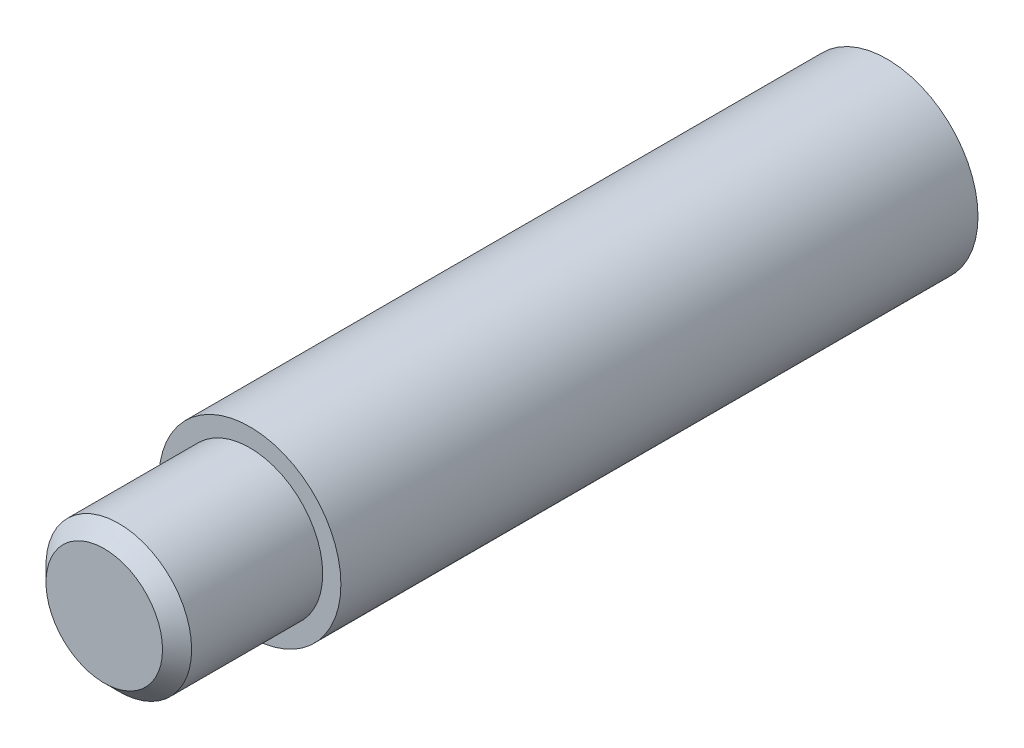
ISO-10303-21;
HEADER;
FILE_DESCRIPTION(('STEP AP214'),'2;1');
FILE_NAME('part.step','',(''),(''),'','','');
FILE_SCHEMA(('AUTOMOTIVE_DESIGN { 1 0 10303 214 1 1 1 1 }'));
ENDSEC;
DATA;
#1=APPLICATION_CONTEXT('core data for automotive mechanical design processes');
#2=APPLICATION_PROTOCOL_DEFINITION('international standard','automotive_design',2000,#1);
#3=PRODUCT_CONTEXT('',#1,'mechanical');
#4=PRODUCT('Part','Part','',(#3));
#5=PRODUCT_RELATED_PRODUCT_CATEGORY('part','',(#4));
#6=PRODUCT_DEFINITION_FORMATION('','',#4);
#7=PRODUCT_DEFINITION_CONTEXT('part definition',#1,'design');
#8=PRODUCT_DEFINITION('design','',#6,#7);
#9=PRODUCT_DEFINITION_SHAPE('','',#8);
#10=(LENGTH_UNIT() NAMED_UNIT(*) SI_UNIT(.MILLI.,.METRE.));
#11=(NAMED_UNIT(*) PLANE_ANGLE_UNIT() SI_UNIT($,.RADIAN.));
#12=(NAMED_UNIT(*) SI_UNIT($,.STERADIAN.) SOLID_ANGLE_UNIT());
#13=UNCERTAINTY_MEASURE_WITH_UNIT(LENGTH_MEASURE(1.E-05),#10,'distance_accuracy_value','');
#14=(GEOMETRIC_REPRESENTATION_CONTEXT(3) GLOBAL_UNCERTAINTY_ASSIGNED_CONTEXT((#13)) GLOBAL_UNIT_ASSIGNED_CONTEXT((#10,
#11,#12)) REPRESENTATION_CONTEXT('',''));
#15=CARTESIAN_POINT('',(0.,0.,0.));
#16=DIRECTION('',(0.,0.,1.));
#17=DIRECTION('',(1.,0.,0.));
#18=AXIS2_PLACEMENT_3D('',#15,#16,#17);
#19=CARTESIAN_POINT('',(0.,0.,35.));
#20=DIRECTION('',(0.,0.,1.));
#21=DIRECTION('',(1.,0.,0.));
#22=AXIS2_PLACEMENT_3D('',#19,#20,#21);
#23=PLANE('',#22);
#24=CARTESIAN_POINT('',(0.,0.,35.));
#25=DIRECTION('',(0.,0.,1.));
#26=DIRECTION('',(1.,0.,0.));
#27=AXIS2_PLACEMENT_3D('',#24,#25,#26);
#28=CIRCLE('',#27,5.);
#29=CARTESIAN_POINT('',(5.,0.,35.));
#30=VERTEX_POINT('',#29);
#31=EDGE_CURVE('E48',#30,#30,#28,.T.);
#32=ORIENTED_EDGE('',*,*,#31,.T.);
#33=EDGE_LOOP('',(#32));
#34=FACE_BOUND('',#33,.T.);
#35=CARTESIAN_POINT('',(0.,0.,35.));
#36=DIRECTION('',(0.,0.,1.));
#37=DIRECTION('',(1.,0.,0.));
#38=AXIS2_PLACEMENT_3D('',#35,#36,#37);
#39=CIRCLE('',#38,4.);
#40=CARTESIAN_POINT('',(4.,0.,35.));
#41=VERTEX_POINT('',#40);
#42=EDGE_CURVE('E57',#41,#41,#39,.T.);
#43=ORIENTED_EDGE('',*,*,#42,.F.);
#44=EDGE_LOOP('',(#43));
#45=FACE_BOUND('',#44,.T.);
#46=ADVANCED_FACE('F37',(#34,#45),#23,.T.);
#47=CARTESIAN_POINT('',(0.,0.,35.));
#48=DIRECTION('',(0.,0.,-1.));
#49=DIRECTION('',(-1.,0.,0.));
#50=AXIS2_PLACEMENT_3D('',#47,#48,#49);
#51=CYLINDRICAL_SURFACE('',#50,5.);
#52=ORIENTED_EDGE('',*,*,#31,.F.);
#53=EDGE_LOOP('',(#52));
#54=FACE_BOUND('',#53,.T.);
#55=CARTESIAN_POINT('',(0.,0.,0.));
#56=DIRECTION('',(0.,0.,1.));
#57=DIRECTION('',(1.,0.,0.));
#58=AXIS2_PLACEMENT_3D('',#55,#56,#57);
#59=CIRCLE('',#58,5.);
#60=CARTESIAN_POINT('',(5.,0.,0.));
#61=VERTEX_POINT('',#60);
#62=EDGE_CURVE('E52',#61,#61,#59,.T.);
#63=ORIENTED_EDGE('',*,*,#62,.T.);
#64=EDGE_LOOP('',(#63));
#65=FACE_BOUND('',#64,.T.);
#66=ADVANCED_FACE('F39',(#54,#65),#51,.T.);
#67=CARTESIAN_POINT('',(0.,0.,0.));
#68=DIRECTION('',(0.,0.,1.));
#69=DIRECTION('',(1.,0.,0.));
#70=AXIS2_PLACEMENT_3D('',#67,#68,#69);
#71=PLANE('',#70);
#72=ORIENTED_EDGE('',*,*,#62,.F.);
#73=EDGE_LOOP('',(#72));
#74=FACE_BOUND('',#73,.T.);
#75=ADVANCED_FACE('F68',(#74),#71,.F.);
#76=CARTESIAN_POINT('',(0.,0.,43.));
#77=DIRECTION('',(0.,0.,-1.));
#78=DIRECTION('',(-1.,0.,0.));
#79=AXIS2_PLACEMENT_3D('',#76,#77,#78);
#80=CYLINDRICAL_SURFACE('',#79,4.);
#81=CARTESIAN_POINT('',(0.,0.,42.2));
#82=DIRECTION('',(0.,0.,1.));
#83=DIRECTION('',(1.,0.,0.));
#84=AXIS2_PLACEMENT_3D('',#81,#82,#83);
#85=CIRCLE('',#84,4.);
#86=CARTESIAN_POINT('',(4.,0.,42.2));
#87=VERTEX_POINT('',#86);
#88=EDGE_CURVE('E10',#87,#87,#85,.F.);
#89=ORIENTED_EDGE('',*,*,#88,.T.);
#90=EDGE_LOOP('',(#89));
#91=FACE_BOUND('',#90,.T.);
#92=ORIENTED_EDGE('',*,*,#42,.T.);
#93=EDGE_LOOP('',(#92));
#94=FACE_BOUND('',#93,.T.);
#95=ADVANCED_FACE('F61',(#91,#94),#80,.T.);
#96=CARTESIAN_POINT('',(0.,0.,43.));
#97=DIRECTION('',(0.,0.,1.));
#98=DIRECTION('',(1.,0.,0.));
#99=AXIS2_PLACEMENT_3D('',#96,#97,#98);
#100=PLANE('',#99);
#101=CARTESIAN_POINT('',(0.,0.,43.));
#102=DIRECTION('',(0.,0.,1.));
#103=DIRECTION('',(1.,0.,0.));
#104=AXIS2_PLACEMENT_3D('',#101,#102,#103);
#105=CIRCLE('',#104,3.19999999999999);
#106=CARTESIAN_POINT('',(3.19999999999999,0.,43.));
#107=VERTEX_POINT('',#106);
#108=EDGE_CURVE('E44',#107,#107,#105,.T.);
#109=ORIENTED_EDGE('',*,*,#108,.T.);
#110=EDGE_LOOP('',(#109));
#111=FACE_BOUND('',#110,.T.);
#112=ADVANCED_FACE('F76',(#111),#100,.T.);
#113=CARTESIAN_POINT('',(0.,0.,43.));
#114=DIRECTION('',(0.,0.,-1.));
#115=DIRECTION('',(-1.,0.,0.));
#116=AXIS2_PLACEMENT_3D('',#113,#114,#115);
#117=CONICAL_SURFACE('',#116,3.19999999999999,0.785398163397451);
#118=ORIENTED_EDGE('',*,*,#88,.F.);
#119=EDGE_LOOP('',(#118));
#120=FACE_BOUND('',#119,.T.);
#121=ORIENTED_EDGE('',*,*,#108,.F.);
#122=EDGE_LOOP('',(#121));
#123=FACE_BOUND('',#122,.T.);
#124=ADVANCED_FACE('F79',(#120,#123),#117,.T.);
#125=CLOSED_SHELL('',(#46,#66,#75,#95,#112,#124));
#126=MANIFOLD_SOLID_BREP('B2',#125);
#127=ADVANCED_BREP_SHAPE_REPRESENTATION('',(#18,#126),#14);
#128=SHAPE_DEFINITION_REPRESENTATION(#9,#127);
ENDSEC;
END-ISO-10303-21;
